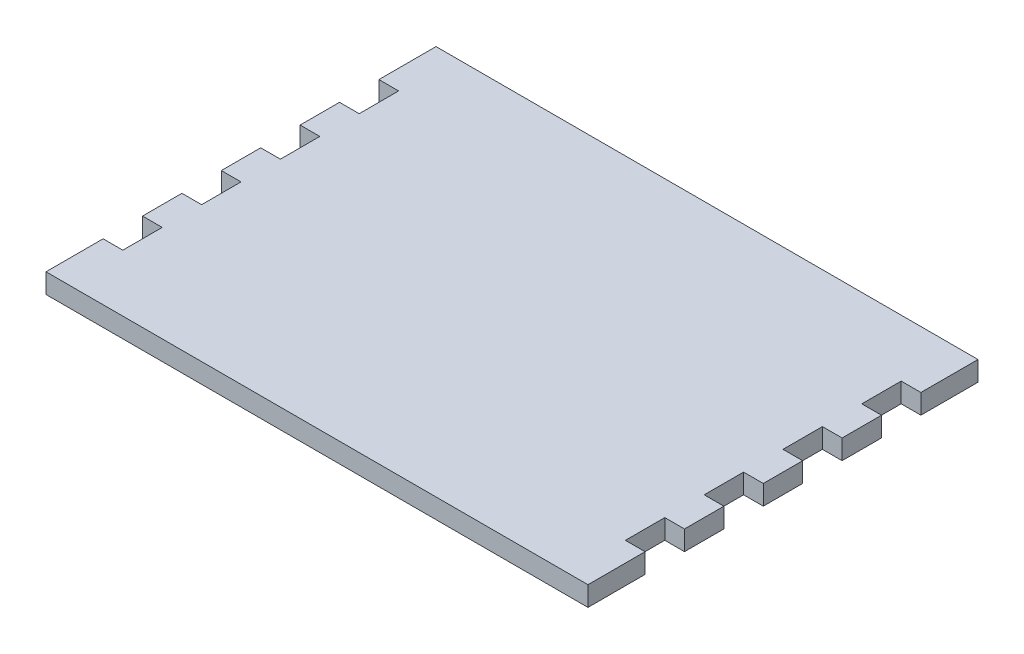
ISO-10303-21;
HEADER;
FILE_DESCRIPTION(('STEP AP214'),'2;1');
FILE_NAME('part.step','',(''),(''),'','','');
FILE_SCHEMA(('AUTOMOTIVE_DESIGN { 1 0 10303 214 1 1 1 1 }'));
ENDSEC;
DATA;
#1=APPLICATION_CONTEXT('core data for automotive mechanical design processes');
#2=APPLICATION_PROTOCOL_DEFINITION('international standard','automotive_design',2000,#1);
#3=PRODUCT_CONTEXT('',#1,'mechanical');
#4=PRODUCT('Part','Part','',(#3));
#5=PRODUCT_RELATED_PRODUCT_CATEGORY('part','',(#4));
#6=PRODUCT_DEFINITION_FORMATION('','',#4);
#7=PRODUCT_DEFINITION_CONTEXT('part definition',#1,'design');
#8=PRODUCT_DEFINITION('design','',#6,#7);
#9=PRODUCT_DEFINITION_SHAPE('','',#8);
#10=(LENGTH_UNIT() NAMED_UNIT(*) SI_UNIT(.MILLI.,.METRE.));
#11=(NAMED_UNIT(*) PLANE_ANGLE_UNIT() SI_UNIT($,.RADIAN.));
#12=(NAMED_UNIT(*) SI_UNIT($,.STERADIAN.) SOLID_ANGLE_UNIT());
#13=UNCERTAINTY_MEASURE_WITH_UNIT(LENGTH_MEASURE(1.E-05),#10,'distance_accuracy_value','');
#14=(GEOMETRIC_REPRESENTATION_CONTEXT(3) GLOBAL_UNCERTAINTY_ASSIGNED_CONTEXT((#13)) GLOBAL_UNIT_ASSIGNED_CONTEXT((#10,
#11,#12)) REPRESENTATION_CONTEXT('',''));
#15=CARTESIAN_POINT('',(0.,0.,0.));
#16=DIRECTION('',(0.,0.,1.));
#17=DIRECTION('',(1.,0.,0.));
#18=AXIS2_PLACEMENT_3D('',#15,#16,#17);
#19=CARTESIAN_POINT('',(87.35,3.175,0.));
#20=DIRECTION('',(0.,0.,-1.));
#21=DIRECTION('',(-1.,0.,0.));
#22=AXIS2_PLACEMENT_3D('',#19,#20,#21);
#23=PLANE('',#22);
#24=DIRECTION('',(1.,0.,0.));
#25=VECTOR('',#24,1.);
#26=CARTESIAN_POINT('',(87.35,0.,0.));
#27=LINE('',#26,#25);
#28=CARTESIAN_POINT('',(0.,0.,0.));
#29=VERTEX_POINT('',#28);
#30=CARTESIAN_POINT('',(87.35,0.,0.));
#31=VERTEX_POINT('',#30);
#32=EDGE_CURVE('E169',#29,#31,#27,.T.);
#33=ORIENTED_EDGE('',*,*,#32,.T.);
#34=DIRECTION('',(0.,-1.,0.));
#35=VECTOR('',#34,1.);
#36=CARTESIAN_POINT('',(87.35,3.175,0.));
#37=LINE('',#36,#35);
#38=CARTESIAN_POINT('',(87.35,3.175,0.));
#39=VERTEX_POINT('',#38);
#40=EDGE_CURVE('E11',#39,#31,#37,.T.);
#41=ORIENTED_EDGE('',*,*,#40,.F.);
#42=DIRECTION('',(1.,0.,0.));
#43=VECTOR('',#42,1.);
#44=CARTESIAN_POINT('',(0.,3.175,0.));
#45=LINE('',#44,#43);
#46=CARTESIAN_POINT('',(0.,3.175,0.));
#47=VERTEX_POINT('',#46);
#48=EDGE_CURVE('E175',#47,#39,#45,.T.);
#49=ORIENTED_EDGE('',*,*,#48,.F.);
#50=DIRECTION('',(0.,-1.,0.));
#51=VECTOR('',#50,1.);
#52=CARTESIAN_POINT('',(0.,3.175,0.));
#53=LINE('',#52,#51);
#54=EDGE_CURVE('E293',#47,#29,#53,.T.);
#55=ORIENTED_EDGE('',*,*,#54,.T.);
#56=EDGE_LOOP('',(#33,#41,#49,#55));
#57=FACE_BOUND('',#56,.T.);
#58=ADVANCED_FACE('F33',(#57),#23,.F.);
#59=CARTESIAN_POINT('',(87.35,3.175,0.));
#60=DIRECTION('',(-1.,0.,0.));
#61=DIRECTION('',(0.,0.,1.));
#62=AXIS2_PLACEMENT_3D('',#59,#60,#61);
#63=PLANE('',#62);
#64=DIRECTION('',(0.,0.,-1.));
#65=VECTOR('',#64,1.);
#66=CARTESIAN_POINT('',(87.35,0.,0.));
#67=LINE('',#66,#65);
#68=CARTESIAN_POINT('',(87.35,0.,-9.205896498));
#69=VERTEX_POINT('',#68);
#70=EDGE_CURVE('E298',#31,#69,#67,.T.);
#71=ORIENTED_EDGE('',*,*,#70,.T.);
#72=DIRECTION('',(0.,-1.,0.));
#73=VECTOR('',#72,1.);
#74=CARTESIAN_POINT('',(87.35,3.175,-9.205896498));
#75=LINE('',#74,#73);
#76=CARTESIAN_POINT('',(87.35,3.175,-9.205896498));
#77=VERTEX_POINT('',#76);
#78=EDGE_CURVE('E41',#77,#69,#75,.T.);
#79=ORIENTED_EDGE('',*,*,#78,.F.);
#80=DIRECTION('',(0.,0.,-1.));
#81=VECTOR('',#80,1.);
#82=CARTESIAN_POINT('',(87.35,3.175,0.));
#83=LINE('',#82,#81);
#84=EDGE_CURVE('E555',#39,#77,#83,.T.);
#85=ORIENTED_EDGE('',*,*,#84,.F.);
#86=ORIENTED_EDGE('',*,*,#40,.T.);
#87=EDGE_LOOP('',(#71,#79,#85,#86));
#88=FACE_BOUND('',#87,.T.);
#89=ADVANCED_FACE('F558',(#88),#63,.F.);
#90=CARTESIAN_POINT('',(87.35,3.175,-9.205896498));
#91=DIRECTION('',(0.,0.,1.));
#92=DIRECTION('',(1.,0.,0.));
#93=AXIS2_PLACEMENT_3D('',#90,#91,#92);
#94=PLANE('',#93);
#95=DIRECTION('',(-1.,0.,0.));
#96=VECTOR('',#95,1.);
#97=CARTESIAN_POINT('',(87.35,0.,-9.205896498));
#98=LINE('',#97,#96);
#99=CARTESIAN_POINT('',(84.175,0.,-9.205896498));
#100=VERTEX_POINT('',#99);
#101=EDGE_CURVE('E300',#69,#100,#98,.T.);
#102=ORIENTED_EDGE('',*,*,#101,.T.);
#103=DIRECTION('',(0.,-1.,0.));
#104=VECTOR('',#103,1.);
#105=CARTESIAN_POINT('',(84.175,3.175,-9.205896498));
#106=LINE('',#105,#104);
#107=CARTESIAN_POINT('',(84.175,3.175,-9.205896498));
#108=VERTEX_POINT('',#107);
#109=EDGE_CURVE('E458',#108,#100,#106,.T.);
#110=ORIENTED_EDGE('',*,*,#109,.F.);
#111=DIRECTION('',(-1.,0.,0.));
#112=VECTOR('',#111,1.);
#113=CARTESIAN_POINT('',(87.35,3.175,-9.205896498));
#114=LINE('',#113,#112);
#115=EDGE_CURVE('E467',#77,#108,#114,.T.);
#116=ORIENTED_EDGE('',*,*,#115,.F.);
#117=ORIENTED_EDGE('',*,*,#78,.T.);
#118=EDGE_LOOP('',(#102,#110,#116,#117));
#119=FACE_BOUND('',#118,.T.);
#120=ADVANCED_FACE('F465',(#119),#94,.F.);
#121=CARTESIAN_POINT('',(84.175,3.175,-9.205896498));
#122=DIRECTION('',(-1.,0.,0.));
#123=DIRECTION('',(0.,0.,1.));
#124=AXIS2_PLACEMENT_3D('',#121,#122,#123);
#125=PLANE('',#124);
#126=DIRECTION('',(0.,0.,-1.));
#127=VECTOR('',#126,1.);
#128=CARTESIAN_POINT('',(84.175,0.,-9.205896498));
#129=LINE('',#128,#127);
#130=CARTESIAN_POINT('',(84.175,0.,-15.555896498));
#131=VERTEX_POINT('',#130);
#132=EDGE_CURVE('E302',#100,#131,#129,.T.);
#133=ORIENTED_EDGE('',*,*,#132,.T.);
#134=DIRECTION('',(0.,-1.,0.));
#135=VECTOR('',#134,1.);
#136=CARTESIAN_POINT('',(84.175,3.175,-15.555896498));
#137=LINE('',#136,#135);
#138=CARTESIAN_POINT('',(84.175,3.175,-15.555896498));
#139=VERTEX_POINT('',#138);
#140=EDGE_CURVE('E455',#139,#131,#137,.T.);
#141=ORIENTED_EDGE('',*,*,#140,.F.);
#142=DIRECTION('',(0.,0.,-1.));
#143=VECTOR('',#142,1.);
#144=CARTESIAN_POINT('',(84.175,3.175,-9.205896498));
#145=LINE('',#144,#143);
#146=EDGE_CURVE('E485',#108,#139,#145,.T.);
#147=ORIENTED_EDGE('',*,*,#146,.F.);
#148=ORIENTED_EDGE('',*,*,#109,.T.);
#149=EDGE_LOOP('',(#133,#141,#147,#148));
#150=FACE_BOUND('',#149,.T.);
#151=ADVANCED_FACE('F476',(#150),#125,.F.);
#152=CARTESIAN_POINT('',(84.175,3.175,-15.555896498));
#153=DIRECTION('',(0.,0.,-1.));
#154=DIRECTION('',(-1.,0.,0.));
#155=AXIS2_PLACEMENT_3D('',#152,#153,#154);
#156=PLANE('',#155);
#157=DIRECTION('',(1.,0.,0.));
#158=VECTOR('',#157,1.);
#159=CARTESIAN_POINT('',(84.175,0.,-15.555896498));
#160=LINE('',#159,#158);
#161=CARTESIAN_POINT('',(87.35,0.,-15.555896498));
#162=VERTEX_POINT('',#161);
#163=EDGE_CURVE('E304',#131,#162,#160,.T.);
#164=ORIENTED_EDGE('',*,*,#163,.T.);
#165=DIRECTION('',(0.,-1.,0.));
#166=VECTOR('',#165,1.);
#167=CARTESIAN_POINT('',(87.35,3.175,-15.555896498));
#168=LINE('',#167,#166);
#169=CARTESIAN_POINT('',(87.35,3.175,-15.555896498));
#170=VERTEX_POINT('',#169);
#171=EDGE_CURVE('E452',#170,#162,#168,.T.);
#172=ORIENTED_EDGE('',*,*,#171,.F.);
#173=DIRECTION('',(1.,0.,0.));
#174=VECTOR('',#173,1.);
#175=CARTESIAN_POINT('',(84.175,3.175,-15.555896498));
#176=LINE('',#175,#174);
#177=EDGE_CURVE('E482',#139,#170,#176,.T.);
#178=ORIENTED_EDGE('',*,*,#177,.F.);
#179=ORIENTED_EDGE('',*,*,#140,.T.);
#180=EDGE_LOOP('',(#164,#172,#178,#179));
#181=FACE_BOUND('',#180,.T.);
#182=ADVANCED_FACE('F480',(#181),#156,.F.);
#183=CARTESIAN_POINT('',(87.35,3.175,-15.555896498));
#184=DIRECTION('',(-1.,0.,0.));
#185=DIRECTION('',(0.,0.,1.));
#186=AXIS2_PLACEMENT_3D('',#183,#184,#185);
#187=PLANE('',#186);
#188=DIRECTION('',(0.,0.,-1.));
#189=VECTOR('',#188,1.);
#190=CARTESIAN_POINT('',(87.35,0.,-15.555896498));
#191=LINE('',#190,#189);
#192=CARTESIAN_POINT('',(87.35,0.,-21.905896498));
#193=VERTEX_POINT('',#192);
#194=EDGE_CURVE('E306',#162,#193,#191,.T.);
#195=ORIENTED_EDGE('',*,*,#194,.T.);
#196=DIRECTION('',(0.,-1.,0.));
#197=VECTOR('',#196,1.);
#198=CARTESIAN_POINT('',(87.35,3.175,-21.905896498));
#199=LINE('',#198,#197);
#200=CARTESIAN_POINT('',(87.35,3.175,-21.905896498));
#201=VERTEX_POINT('',#200);
#202=EDGE_CURVE('E449',#201,#193,#199,.T.);
#203=ORIENTED_EDGE('',*,*,#202,.F.);
#204=DIRECTION('',(0.,0.,-1.));
#205=VECTOR('',#204,1.);
#206=CARTESIAN_POINT('',(87.35,3.175,-15.555896498));
#207=LINE('',#206,#205);
#208=EDGE_CURVE('E484',#170,#201,#207,.T.);
#209=ORIENTED_EDGE('',*,*,#208,.F.);
#210=ORIENTED_EDGE('',*,*,#171,.T.);
#211=EDGE_LOOP('',(#195,#203,#209,#210));
#212=FACE_BOUND('',#211,.T.);
#213=ADVANCED_FACE('F570',(#212),#187,.F.);
#214=CARTESIAN_POINT('',(87.35,3.175,-21.905896498));
#215=DIRECTION('',(0.,0.,1.));
#216=DIRECTION('',(1.,0.,0.));
#217=AXIS2_PLACEMENT_3D('',#214,#215,#216);
#218=PLANE('',#217);
#219=DIRECTION('',(-1.,0.,0.));
#220=VECTOR('',#219,1.);
#221=CARTESIAN_POINT('',(87.35,0.,-21.905896498));
#222=LINE('',#221,#220);
#223=CARTESIAN_POINT('',(84.175,0.,-21.905896498));
#224=VERTEX_POINT('',#223);
#225=EDGE_CURVE('E308',#193,#224,#222,.T.);
#226=ORIENTED_EDGE('',*,*,#225,.T.);
#227=DIRECTION('',(0.,-1.,0.));
#228=VECTOR('',#227,1.);
#229=CARTESIAN_POINT('',(84.175,3.175,-21.905896498));
#230=LINE('',#229,#228);
#231=CARTESIAN_POINT('',(84.175,3.175,-21.905896498));
#232=VERTEX_POINT('',#231);
#233=EDGE_CURVE('E446',#232,#224,#230,.T.);
#234=ORIENTED_EDGE('',*,*,#233,.F.);
#235=DIRECTION('',(-1.,0.,0.));
#236=VECTOR('',#235,1.);
#237=CARTESIAN_POINT('',(87.35,3.175,-21.905896498));
#238=LINE('',#237,#236);
#239=EDGE_CURVE('E487',#201,#232,#238,.T.);
#240=ORIENTED_EDGE('',*,*,#239,.F.);
#241=ORIENTED_EDGE('',*,*,#202,.T.);
#242=EDGE_LOOP('',(#226,#234,#240,#241));
#243=FACE_BOUND('',#242,.T.);
#244=ADVANCED_FACE('F573',(#243),#218,.F.);
#245=CARTESIAN_POINT('',(84.175,3.175,-21.905896498));
#246=DIRECTION('',(-1.,0.,0.));
#247=DIRECTION('',(0.,0.,1.));
#248=AXIS2_PLACEMENT_3D('',#245,#246,#247);
#249=PLANE('',#248);
#250=DIRECTION('',(0.,0.,-1.));
#251=VECTOR('',#250,1.);
#252=CARTESIAN_POINT('',(84.175,0.,-21.905896498));
#253=LINE('',#252,#251);
#254=CARTESIAN_POINT('',(84.175,0.,-28.255896498));
#255=VERTEX_POINT('',#254);
#256=EDGE_CURVE('E310',#224,#255,#253,.T.);
#257=ORIENTED_EDGE('',*,*,#256,.T.);
#258=DIRECTION('',(0.,-1.,0.));
#259=VECTOR('',#258,1.);
#260=CARTESIAN_POINT('',(84.175,3.175,-28.255896498));
#261=LINE('',#260,#259);
#262=CARTESIAN_POINT('',(84.175,3.175,-28.255896498));
#263=VERTEX_POINT('',#262);
#264=EDGE_CURVE('E443',#263,#255,#261,.T.);
#265=ORIENTED_EDGE('',*,*,#264,.F.);
#266=DIRECTION('',(0.,0.,-1.));
#267=VECTOR('',#266,1.);
#268=CARTESIAN_POINT('',(84.175,3.175,-21.905896498));
#269=LINE('',#268,#267);
#270=EDGE_CURVE('E493',#232,#263,#269,.T.);
#271=ORIENTED_EDGE('',*,*,#270,.F.);
#272=ORIENTED_EDGE('',*,*,#233,.T.);
#273=EDGE_LOOP('',(#257,#265,#271,#272));
#274=FACE_BOUND('',#273,.T.);
#275=ADVANCED_FACE('F577',(#274),#249,.F.);
#276=CARTESIAN_POINT('',(84.175,3.175,-28.255896498));
#277=DIRECTION('',(0.,0.,-1.));
#278=DIRECTION('',(-1.,0.,0.));
#279=AXIS2_PLACEMENT_3D('',#276,#277,#278);
#280=PLANE('',#279);
#281=DIRECTION('',(1.,0.,0.));
#282=VECTOR('',#281,1.);
#283=CARTESIAN_POINT('',(84.175,0.,-28.255896498));
#284=LINE('',#283,#282);
#285=CARTESIAN_POINT('',(87.35,0.,-28.255896498));
#286=VERTEX_POINT('',#285);
#287=EDGE_CURVE('E312',#255,#286,#284,.T.);
#288=ORIENTED_EDGE('',*,*,#287,.T.);
#289=DIRECTION('',(0.,-1.,0.));
#290=VECTOR('',#289,1.);
#291=CARTESIAN_POINT('',(87.35,3.175,-28.255896498));
#292=LINE('',#291,#290);
#293=CARTESIAN_POINT('',(87.35,3.175,-28.255896498));
#294=VERTEX_POINT('',#293);
#295=EDGE_CURVE('E440',#294,#286,#292,.T.);
#296=ORIENTED_EDGE('',*,*,#295,.F.);
#297=DIRECTION('',(1.,0.,0.));
#298=VECTOR('',#297,1.);
#299=CARTESIAN_POINT('',(84.175,3.175,-28.255896498));
#300=LINE('',#299,#298);
#301=EDGE_CURVE('E495',#263,#294,#300,.T.);
#302=ORIENTED_EDGE('',*,*,#301,.F.);
#303=ORIENTED_EDGE('',*,*,#264,.T.);
#304=EDGE_LOOP('',(#288,#296,#302,#303));
#305=FACE_BOUND('',#304,.T.);
#306=ADVANCED_FACE('F581',(#305),#280,.F.);
#307=CARTESIAN_POINT('',(87.35,3.175,-28.255896498));
#308=DIRECTION('',(-1.,0.,0.));
#309=DIRECTION('',(0.,0.,1.));
#310=AXIS2_PLACEMENT_3D('',#307,#308,#309);
#311=PLANE('',#310);
#312=DIRECTION('',(0.,0.,-1.));
#313=VECTOR('',#312,1.);
#314=CARTESIAN_POINT('',(87.35,0.,-28.255896498));
#315=LINE('',#314,#313);
#316=CARTESIAN_POINT('',(87.35,0.,-34.605896498));
#317=VERTEX_POINT('',#316);
#318=EDGE_CURVE('E314',#286,#317,#315,.T.);
#319=ORIENTED_EDGE('',*,*,#318,.T.);
#320=DIRECTION('',(0.,-1.,0.));
#321=VECTOR('',#320,1.);
#322=CARTESIAN_POINT('',(87.35,3.175,-34.605896498));
#323=LINE('',#322,#321);
#324=CARTESIAN_POINT('',(87.35,3.175,-34.605896498));
#325=VERTEX_POINT('',#324);
#326=EDGE_CURVE('E437',#325,#317,#323,.T.);
#327=ORIENTED_EDGE('',*,*,#326,.F.);
#328=DIRECTION('',(0.,0.,-1.));
#329=VECTOR('',#328,1.);
#330=CARTESIAN_POINT('',(87.35,3.175,-28.255896498));
#331=LINE('',#330,#329);
#332=EDGE_CURVE('E497',#294,#325,#331,.T.);
#333=ORIENTED_EDGE('',*,*,#332,.F.);
#334=ORIENTED_EDGE('',*,*,#295,.T.);
#335=EDGE_LOOP('',(#319,#327,#333,#334));
#336=FACE_BOUND('',#335,.T.);
#337=ADVANCED_FACE('F585',(#336),#311,.F.);
#338=CARTESIAN_POINT('',(87.35,3.175,-34.605896498));
#339=DIRECTION('',(0.,0.,1.));
#340=DIRECTION('',(1.,0.,0.));
#341=AXIS2_PLACEMENT_3D('',#338,#339,#340);
#342=PLANE('',#341);
#343=DIRECTION('',(-1.,0.,0.));
#344=VECTOR('',#343,1.);
#345=CARTESIAN_POINT('',(87.35,0.,-34.605896498));
#346=LINE('',#345,#344);
#347=CARTESIAN_POINT('',(84.175,0.,-34.605896498));
#348=VERTEX_POINT('',#347);
#349=EDGE_CURVE('E316',#317,#348,#346,.T.);
#350=ORIENTED_EDGE('',*,*,#349,.T.);
#351=DIRECTION('',(0.,-1.,0.));
#352=VECTOR('',#351,1.);
#353=CARTESIAN_POINT('',(84.175,3.175,-34.605896498));
#354=LINE('',#353,#352);
#355=CARTESIAN_POINT('',(84.175,3.175,-34.605896498));
#356=VERTEX_POINT('',#355);
#357=EDGE_CURVE('E434',#356,#348,#354,.T.);
#358=ORIENTED_EDGE('',*,*,#357,.F.);
#359=DIRECTION('',(-1.,0.,0.));
#360=VECTOR('',#359,1.);
#361=CARTESIAN_POINT('',(87.35,3.175,-34.605896498));
#362=LINE('',#361,#360);
#363=EDGE_CURVE('E499',#325,#356,#362,.T.);
#364=ORIENTED_EDGE('',*,*,#363,.F.);
#365=ORIENTED_EDGE('',*,*,#326,.T.);
#366=EDGE_LOOP('',(#350,#358,#364,#365));
#367=FACE_BOUND('',#366,.T.);
#368=ADVANCED_FACE('F589',(#367),#342,.F.);
#369=CARTESIAN_POINT('',(84.175,3.175,-34.605896498));
#370=DIRECTION('',(-1.,0.,0.));
#371=DIRECTION('',(0.,0.,1.));
#372=AXIS2_PLACEMENT_3D('',#369,#370,#371);
#373=PLANE('',#372);
#374=DIRECTION('',(0.,0.,-1.));
#375=VECTOR('',#374,1.);
#376=CARTESIAN_POINT('',(84.175,0.,-34.605896498));
#377=LINE('',#376,#375);
#378=CARTESIAN_POINT('',(84.175,0.,-40.955896498));
#379=VERTEX_POINT('',#378);
#380=EDGE_CURVE('E318',#348,#379,#377,.T.);
#381=ORIENTED_EDGE('',*,*,#380,.T.);
#382=DIRECTION('',(0.,-1.,0.));
#383=VECTOR('',#382,1.);
#384=CARTESIAN_POINT('',(84.175,3.175,-40.955896498));
#385=LINE('',#384,#383);
#386=CARTESIAN_POINT('',(84.175,3.175,-40.955896498));
#387=VERTEX_POINT('',#386);
#388=EDGE_CURVE('E431',#387,#379,#385,.T.);
#389=ORIENTED_EDGE('',*,*,#388,.F.);
#390=DIRECTION('',(0.,0.,-1.));
#391=VECTOR('',#390,1.);
#392=CARTESIAN_POINT('',(84.175,3.175,-34.605896498));
#393=LINE('',#392,#391);
#394=EDGE_CURVE('E501',#356,#387,#393,.T.);
#395=ORIENTED_EDGE('',*,*,#394,.F.);
#396=ORIENTED_EDGE('',*,*,#357,.T.);
#397=EDGE_LOOP('',(#381,#389,#395,#396));
#398=FACE_BOUND('',#397,.T.);
#399=ADVANCED_FACE('F593',(#398),#373,.F.);
#400=CARTESIAN_POINT('',(84.175,3.175,-40.955896498));
#401=DIRECTION('',(0.,0.,-1.));
#402=DIRECTION('',(-1.,0.,0.));
#403=AXIS2_PLACEMENT_3D('',#400,#401,#402);
#404=PLANE('',#403);
#405=DIRECTION('',(1.,0.,0.));
#406=VECTOR('',#405,1.);
#407=CARTESIAN_POINT('',(84.175,0.,-40.955896498));
#408=LINE('',#407,#406);
#409=CARTESIAN_POINT('',(87.35,0.,-40.955896498));
#410=VERTEX_POINT('',#409);
#411=EDGE_CURVE('E320',#379,#410,#408,.T.);
#412=ORIENTED_EDGE('',*,*,#411,.T.);
#413=DIRECTION('',(0.,-1.,0.));
#414=VECTOR('',#413,1.);
#415=CARTESIAN_POINT('',(87.35,3.175,-40.955896498));
#416=LINE('',#415,#414);
#417=CARTESIAN_POINT('',(87.35,3.175,-40.955896498));
#418=VERTEX_POINT('',#417);
#419=EDGE_CURVE('E428',#418,#410,#416,.T.);
#420=ORIENTED_EDGE('',*,*,#419,.F.);
#421=DIRECTION('',(1.,0.,0.));
#422=VECTOR('',#421,1.);
#423=CARTESIAN_POINT('',(84.175,3.175,-40.955896498));
#424=LINE('',#423,#422);
#425=EDGE_CURVE('E503',#387,#418,#424,.T.);
#426=ORIENTED_EDGE('',*,*,#425,.F.);
#427=ORIENTED_EDGE('',*,*,#388,.T.);
#428=EDGE_LOOP('',(#412,#420,#426,#427));
#429=FACE_BOUND('',#428,.T.);
#430=ADVANCED_FACE('F597',(#429),#404,.F.);
#431=CARTESIAN_POINT('',(87.35,3.175,-40.955896498));
#432=DIRECTION('',(-1.,0.,0.));
#433=DIRECTION('',(0.,0.,1.));
#434=AXIS2_PLACEMENT_3D('',#431,#432,#433);
#435=PLANE('',#434);
#436=DIRECTION('',(0.,0.,-1.));
#437=VECTOR('',#436,1.);
#438=CARTESIAN_POINT('',(87.35,0.,-40.955896498));
#439=LINE('',#438,#437);
#440=CARTESIAN_POINT('',(87.35,0.,-47.305896498));
#441=VERTEX_POINT('',#440);
#442=EDGE_CURVE('E322',#410,#441,#439,.T.);
#443=ORIENTED_EDGE('',*,*,#442,.T.);
#444=DIRECTION('',(0.,-1.,0.));
#445=VECTOR('',#444,1.);
#446=CARTESIAN_POINT('',(87.35,3.175,-47.305896498));
#447=LINE('',#446,#445);
#448=CARTESIAN_POINT('',(87.35,3.175,-47.305896498));
#449=VERTEX_POINT('',#448);
#450=EDGE_CURVE('E425',#449,#441,#447,.T.);
#451=ORIENTED_EDGE('',*,*,#450,.F.);
#452=DIRECTION('',(0.,0.,-1.));
#453=VECTOR('',#452,1.);
#454=CARTESIAN_POINT('',(87.35,3.175,-40.955896498));
#455=LINE('',#454,#453);
#456=EDGE_CURVE('E505',#418,#449,#455,.T.);
#457=ORIENTED_EDGE('',*,*,#456,.F.);
#458=ORIENTED_EDGE('',*,*,#419,.T.);
#459=EDGE_LOOP('',(#443,#451,#457,#458));
#460=FACE_BOUND('',#459,.T.);
#461=ADVANCED_FACE('F601',(#460),#435,.F.);
#462=CARTESIAN_POINT('',(87.35,3.175,-47.305896498));
#463=DIRECTION('',(0.,0.,1.));
#464=DIRECTION('',(1.,0.,0.));
#465=AXIS2_PLACEMENT_3D('',#462,#463,#464);
#466=PLANE('',#465);
#467=DIRECTION('',(-1.,0.,0.));
#468=VECTOR('',#467,1.);
#469=CARTESIAN_POINT('',(87.35,0.,-47.305896498));
#470=LINE('',#469,#468);
#471=CARTESIAN_POINT('',(84.175,0.,-47.305896498));
#472=VERTEX_POINT('',#471);
#473=EDGE_CURVE('E324',#441,#472,#470,.T.);
#474=ORIENTED_EDGE('',*,*,#473,.T.);
#475=DIRECTION('',(0.,-1.,0.));
#476=VECTOR('',#475,1.);
#477=CARTESIAN_POINT('',(84.175,3.175,-47.305896498));
#478=LINE('',#477,#476);
#479=CARTESIAN_POINT('',(84.175,3.175,-47.305896498));
#480=VERTEX_POINT('',#479);
#481=EDGE_CURVE('E422',#480,#472,#478,.T.);
#482=ORIENTED_EDGE('',*,*,#481,.F.);
#483=DIRECTION('',(-1.,0.,0.));
#484=VECTOR('',#483,1.);
#485=CARTESIAN_POINT('',(87.35,3.175,-47.305896498));
#486=LINE('',#485,#484);
#487=EDGE_CURVE('E507',#449,#480,#486,.T.);
#488=ORIENTED_EDGE('',*,*,#487,.F.);
#489=ORIENTED_EDGE('',*,*,#450,.T.);
#490=EDGE_LOOP('',(#474,#482,#488,#489));
#491=FACE_BOUND('',#490,.T.);
#492=ADVANCED_FACE('F605',(#491),#466,.F.);
#493=CARTESIAN_POINT('',(84.175,3.175,-47.305896498));
#494=DIRECTION('',(-1.,0.,0.));
#495=DIRECTION('',(0.,0.,1.));
#496=AXIS2_PLACEMENT_3D('',#493,#494,#495);
#497=PLANE('',#496);
#498=DIRECTION('',(0.,0.,-1.));
#499=VECTOR('',#498,1.);
#500=CARTESIAN_POINT('',(84.175,0.,-47.305896498));
#501=LINE('',#500,#499);
#502=CARTESIAN_POINT('',(84.175,0.,-53.655896498));
#503=VERTEX_POINT('',#502);
#504=EDGE_CURVE('E326',#472,#503,#501,.T.);
#505=ORIENTED_EDGE('',*,*,#504,.T.);
#506=DIRECTION('',(0.,-1.,0.));
#507=VECTOR('',#506,1.);
#508=CARTESIAN_POINT('',(84.175,3.175,-53.655896498));
#509=LINE('',#508,#507);
#510=CARTESIAN_POINT('',(84.175,3.175,-53.655896498));
#511=VERTEX_POINT('',#510);
#512=EDGE_CURVE('E419',#511,#503,#509,.T.);
#513=ORIENTED_EDGE('',*,*,#512,.F.);
#514=DIRECTION('',(0.,0.,-1.));
#515=VECTOR('',#514,1.);
#516=CARTESIAN_POINT('',(84.175,3.175,-47.305896498));
#517=LINE('',#516,#515);
#518=EDGE_CURVE('E509',#480,#511,#517,.T.);
#519=ORIENTED_EDGE('',*,*,#518,.F.);
#520=ORIENTED_EDGE('',*,*,#481,.T.);
#521=EDGE_LOOP('',(#505,#513,#519,#520));
#522=FACE_BOUND('',#521,.T.);
#523=ADVANCED_FACE('F609',(#522),#497,.F.);
#524=CARTESIAN_POINT('',(84.175,3.175,-53.655896498));
#525=DIRECTION('',(0.,0.,-1.));
#526=DIRECTION('',(-1.,0.,0.));
#527=AXIS2_PLACEMENT_3D('',#524,#525,#526);
#528=PLANE('',#527);
#529=DIRECTION('',(1.,0.,0.));
#530=VECTOR('',#529,1.);
#531=CARTESIAN_POINT('',(84.175,0.,-53.655896498));
#532=LINE('',#531,#530);
#533=CARTESIAN_POINT('',(87.35,0.,-53.655896498));
#534=VERTEX_POINT('',#533);
#535=EDGE_CURVE('E328',#503,#534,#532,.T.);
#536=ORIENTED_EDGE('',*,*,#535,.T.);
#537=DIRECTION('',(0.,-1.,0.));
#538=VECTOR('',#537,1.);
#539=CARTESIAN_POINT('',(87.35,3.175,-53.655896498));
#540=LINE('',#539,#538);
#541=CARTESIAN_POINT('',(87.35,3.175,-53.655896498));
#542=VERTEX_POINT('',#541);
#543=EDGE_CURVE('E416',#542,#534,#540,.T.);
#544=ORIENTED_EDGE('',*,*,#543,.F.);
#545=DIRECTION('',(1.,0.,0.));
#546=VECTOR('',#545,1.);
#547=CARTESIAN_POINT('',(84.175,3.175,-53.655896498));
#548=LINE('',#547,#546);
#549=EDGE_CURVE('E511',#511,#542,#548,.T.);
#550=ORIENTED_EDGE('',*,*,#549,.F.);
#551=ORIENTED_EDGE('',*,*,#512,.T.);
#552=EDGE_LOOP('',(#536,#544,#550,#551));
#553=FACE_BOUND('',#552,.T.);
#554=ADVANCED_FACE('F613',(#553),#528,.F.);
#555=CARTESIAN_POINT('',(87.35,3.175,-53.655896498));
#556=DIRECTION('',(-1.,0.,0.));
#557=DIRECTION('',(0.,0.,1.));
#558=AXIS2_PLACEMENT_3D('',#555,#556,#557);
#559=PLANE('',#558);
#560=DIRECTION('',(0.,0.,-1.));
#561=VECTOR('',#560,1.);
#562=CARTESIAN_POINT('',(87.35,0.,-53.655896498));
#563=LINE('',#562,#561);
#564=CARTESIAN_POINT('',(87.35,0.,-62.861792996));
#565=VERTEX_POINT('',#564);
#566=EDGE_CURVE('E330',#534,#565,#563,.T.);
#567=ORIENTED_EDGE('',*,*,#566,.T.);
#568=DIRECTION('',(0.,-1.,0.));
#569=VECTOR('',#568,1.);
#570=CARTESIAN_POINT('',(87.35,3.175,-62.861792996));
#571=LINE('',#570,#569);
#572=CARTESIAN_POINT('',(87.35,3.175,-62.861792996));
#573=VERTEX_POINT('',#572);
#574=EDGE_CURVE('E413',#573,#565,#571,.T.);
#575=ORIENTED_EDGE('',*,*,#574,.F.);
#576=DIRECTION('',(0.,0.,-1.));
#577=VECTOR('',#576,1.);
#578=CARTESIAN_POINT('',(87.35,3.175,-53.655896498));
#579=LINE('',#578,#577);
#580=EDGE_CURVE('E513',#542,#573,#579,.T.);
#581=ORIENTED_EDGE('',*,*,#580,.F.);
#582=ORIENTED_EDGE('',*,*,#543,.T.);
#583=EDGE_LOOP('',(#567,#575,#581,#582));
#584=FACE_BOUND('',#583,.T.);
#585=ADVANCED_FACE('F617',(#584),#559,.F.);
#586=CARTESIAN_POINT('',(0.,3.175,-62.861792996));
#587=DIRECTION('',(0.,0.,1.));
#588=DIRECTION('',(1.,0.,0.));
#589=AXIS2_PLACEMENT_3D('',#586,#587,#588);
#590=PLANE('',#589);
#591=DIRECTION('',(-1.,0.,0.));
#592=VECTOR('',#591,1.);
#593=CARTESIAN_POINT('',(0.,0.,-62.861792996));
#594=LINE('',#593,#592);
#595=CARTESIAN_POINT('',(0.,0.,-62.861792996));
#596=VERTEX_POINT('',#595);
#597=EDGE_CURVE('E333',#565,#596,#594,.T.);
#598=ORIENTED_EDGE('',*,*,#597,.T.);
#599=DIRECTION('',(0.,-1.,0.));
#600=VECTOR('',#599,1.);
#601=CARTESIAN_POINT('',(0.,3.175,-62.861792996));
#602=LINE('',#601,#600);
#603=CARTESIAN_POINT('',(0.,3.175,-62.861792996));
#604=VERTEX_POINT('',#603);
#605=EDGE_CURVE('E410',#604,#596,#602,.T.);
#606=ORIENTED_EDGE('',*,*,#605,.F.);
#607=DIRECTION('',(-1.,0.,0.));
#608=VECTOR('',#607,1.);
#609=CARTESIAN_POINT('',(87.35,3.175,-62.861792996));
#610=LINE('',#609,#608);
#611=EDGE_CURVE('E515',#573,#604,#610,.T.);
#612=ORIENTED_EDGE('',*,*,#611,.F.);
#613=ORIENTED_EDGE('',*,*,#574,.T.);
#614=EDGE_LOOP('',(#598,#606,#612,#613));
#615=FACE_BOUND('',#614,.T.);
#616=ADVANCED_FACE('F621',(#615),#590,.F.);
#617=CARTESIAN_POINT('',(0.,3.175,-53.655896498));
#618=DIRECTION('',(1.,0.,0.));
#619=DIRECTION('',(0.,0.,-1.));
#620=AXIS2_PLACEMENT_3D('',#617,#618,#619);
#621=PLANE('',#620);
#622=DIRECTION('',(0.,0.,1.));
#623=VECTOR('',#622,1.);
#624=CARTESIAN_POINT('',(0.,0.,-53.655896498));
#625=LINE('',#624,#623);
#626=CARTESIAN_POINT('',(0.,0.,-53.655896498));
#627=VERTEX_POINT('',#626);
#628=EDGE_CURVE('E335',#596,#627,#625,.T.);
#629=ORIENTED_EDGE('',*,*,#628,.T.);
#630=DIRECTION('',(0.,-1.,0.));
#631=VECTOR('',#630,1.);
#632=CARTESIAN_POINT('',(0.,3.175,-53.655896498));
#633=LINE('',#632,#631);
#634=CARTESIAN_POINT('',(0.,3.175,-53.655896498));
#635=VERTEX_POINT('',#634);
#636=EDGE_CURVE('E407',#635,#627,#633,.T.);
#637=ORIENTED_EDGE('',*,*,#636,.F.);
#638=DIRECTION('',(0.,0.,1.));
#639=VECTOR('',#638,1.);
#640=CARTESIAN_POINT('',(0.,3.175,-53.655896498));
#641=LINE('',#640,#639);
#642=EDGE_CURVE('E517',#604,#635,#641,.T.);
#643=ORIENTED_EDGE('',*,*,#642,.F.);
#644=ORIENTED_EDGE('',*,*,#605,.T.);
#645=EDGE_LOOP('',(#629,#637,#643,#644));
#646=FACE_BOUND('',#645,.T.);
#647=ADVANCED_FACE('F625',(#646),#621,.F.);
#648=CARTESIAN_POINT('',(3.175,3.175,-53.655896498));
#649=DIRECTION('',(0.,0.,-1.));
#650=DIRECTION('',(-1.,0.,0.));
#651=AXIS2_PLACEMENT_3D('',#648,#649,#650);
#652=PLANE('',#651);
#653=DIRECTION('',(1.,0.,0.));
#654=VECTOR('',#653,1.);
#655=CARTESIAN_POINT('',(3.175,0.,-53.655896498));
#656=LINE('',#655,#654);
#657=CARTESIAN_POINT('',(3.175,0.,-53.655896498));
#658=VERTEX_POINT('',#657);
#659=EDGE_CURVE('E337',#627,#658,#656,.T.);
#660=ORIENTED_EDGE('',*,*,#659,.T.);
#661=DIRECTION('',(0.,-1.,0.));
#662=VECTOR('',#661,1.);
#663=CARTESIAN_POINT('',(3.175,3.175,-53.655896498));
#664=LINE('',#663,#662);
#665=CARTESIAN_POINT('',(3.175,3.175,-53.655896498));
#666=VERTEX_POINT('',#665);
#667=EDGE_CURVE('E404',#666,#658,#664,.T.);
#668=ORIENTED_EDGE('',*,*,#667,.F.);
#669=DIRECTION('',(1.,0.,0.));
#670=VECTOR('',#669,1.);
#671=CARTESIAN_POINT('',(3.175,3.175,-53.655896498));
#672=LINE('',#671,#670);
#673=EDGE_CURVE('E519',#635,#666,#672,.T.);
#674=ORIENTED_EDGE('',*,*,#673,.F.);
#675=ORIENTED_EDGE('',*,*,#636,.T.);
#676=EDGE_LOOP('',(#660,#668,#674,#675));
#677=FACE_BOUND('',#676,.T.);
#678=ADVANCED_FACE('F629',(#677),#652,.F.);
#679=CARTESIAN_POINT('',(3.175,3.175,-47.305896498));
#680=DIRECTION('',(1.,0.,0.));
#681=DIRECTION('',(0.,0.,-1.));
#682=AXIS2_PLACEMENT_3D('',#679,#680,#681);
#683=PLANE('',#682);
#684=DIRECTION('',(0.,0.,1.));
#685=VECTOR('',#684,1.);
#686=CARTESIAN_POINT('',(3.175,0.,-47.305896498));
#687=LINE('',#686,#685);
#688=CARTESIAN_POINT('',(3.175,0.,-47.305896498));
#689=VERTEX_POINT('',#688);
#690=EDGE_CURVE('E339',#658,#689,#687,.T.);
#691=ORIENTED_EDGE('',*,*,#690,.T.);
#692=DIRECTION('',(0.,-1.,0.));
#693=VECTOR('',#692,1.);
#694=CARTESIAN_POINT('',(3.175,3.175,-47.305896498));
#695=LINE('',#694,#693);
#696=CARTESIAN_POINT('',(3.175,3.175,-47.305896498));
#697=VERTEX_POINT('',#696);
#698=EDGE_CURVE('E401',#697,#689,#695,.T.);
#699=ORIENTED_EDGE('',*,*,#698,.F.);
#700=DIRECTION('',(0.,0.,1.));
#701=VECTOR('',#700,1.);
#702=CARTESIAN_POINT('',(3.175,3.175,-47.305896498));
#703=LINE('',#702,#701);
#704=EDGE_CURVE('E521',#666,#697,#703,.T.);
#705=ORIENTED_EDGE('',*,*,#704,.F.);
#706=ORIENTED_EDGE('',*,*,#667,.T.);
#707=EDGE_LOOP('',(#691,#699,#705,#706));
#708=FACE_BOUND('',#707,.T.);
#709=ADVANCED_FACE('F633',(#708),#683,.F.);
#710=CARTESIAN_POINT('',(0.,3.175,-47.305896498));
#711=DIRECTION('',(0.,0.,1.));
#712=DIRECTION('',(1.,0.,0.));
#713=AXIS2_PLACEMENT_3D('',#710,#711,#712);
#714=PLANE('',#713);
#715=DIRECTION('',(-1.,0.,0.));
#716=VECTOR('',#715,1.);
#717=CARTESIAN_POINT('',(0.,0.,-47.305896498));
#718=LINE('',#717,#716);
#719=CARTESIAN_POINT('',(0.,0.,-47.305896498));
#720=VERTEX_POINT('',#719);
#721=EDGE_CURVE('E341',#689,#720,#718,.T.);
#722=ORIENTED_EDGE('',*,*,#721,.T.);
#723=DIRECTION('',(0.,-1.,0.));
#724=VECTOR('',#723,1.);
#725=CARTESIAN_POINT('',(0.,3.175,-47.305896498));
#726=LINE('',#725,#724);
#727=CARTESIAN_POINT('',(0.,3.175,-47.305896498));
#728=VERTEX_POINT('',#727);
#729=EDGE_CURVE('E398',#728,#720,#726,.T.);
#730=ORIENTED_EDGE('',*,*,#729,.F.);
#731=DIRECTION('',(-1.,0.,0.));
#732=VECTOR('',#731,1.);
#733=CARTESIAN_POINT('',(0.,3.175,-47.305896498));
#734=LINE('',#733,#732);
#735=EDGE_CURVE('E523',#697,#728,#734,.T.);
#736=ORIENTED_EDGE('',*,*,#735,.F.);
#737=ORIENTED_EDGE('',*,*,#698,.T.);
#738=EDGE_LOOP('',(#722,#730,#736,#737));
#739=FACE_BOUND('',#738,.T.);
#740=ADVANCED_FACE('F637',(#739),#714,.F.);
#741=CARTESIAN_POINT('',(0.,3.175,-40.955896498));
#742=DIRECTION('',(1.,0.,0.));
#743=DIRECTION('',(0.,0.,-1.));
#744=AXIS2_PLACEMENT_3D('',#741,#742,#743);
#745=PLANE('',#744);
#746=DIRECTION('',(0.,0.,1.));
#747=VECTOR('',#746,1.);
#748=CARTESIAN_POINT('',(0.,0.,-40.955896498));
#749=LINE('',#748,#747);
#750=CARTESIAN_POINT('',(0.,0.,-40.955896498));
#751=VERTEX_POINT('',#750);
#752=EDGE_CURVE('E343',#720,#751,#749,.T.);
#753=ORIENTED_EDGE('',*,*,#752,.T.);
#754=DIRECTION('',(0.,-1.,0.));
#755=VECTOR('',#754,1.);
#756=CARTESIAN_POINT('',(0.,3.175,-40.955896498));
#757=LINE('',#756,#755);
#758=CARTESIAN_POINT('',(0.,3.175,-40.955896498));
#759=VERTEX_POINT('',#758);
#760=EDGE_CURVE('E395',#759,#751,#757,.T.);
#761=ORIENTED_EDGE('',*,*,#760,.F.);
#762=DIRECTION('',(0.,0.,1.));
#763=VECTOR('',#762,1.);
#764=CARTESIAN_POINT('',(0.,3.175,-40.955896498));
#765=LINE('',#764,#763);
#766=EDGE_CURVE('E525',#728,#759,#765,.T.);
#767=ORIENTED_EDGE('',*,*,#766,.F.);
#768=ORIENTED_EDGE('',*,*,#729,.T.);
#769=EDGE_LOOP('',(#753,#761,#767,#768));
#770=FACE_BOUND('',#769,.T.);
#771=ADVANCED_FACE('F641',(#770),#745,.F.);
#772=CARTESIAN_POINT('',(3.175,3.175,-40.955896498));
#773=DIRECTION('',(0.,0.,-1.));
#774=DIRECTION('',(-1.,0.,0.));
#775=AXIS2_PLACEMENT_3D('',#772,#773,#774);
#776=PLANE('',#775);
#777=DIRECTION('',(1.,0.,0.));
#778=VECTOR('',#777,1.);
#779=CARTESIAN_POINT('',(3.175,0.,-40.955896498));
#780=LINE('',#779,#778);
#781=CARTESIAN_POINT('',(3.175,0.,-40.955896498));
#782=VERTEX_POINT('',#781);
#783=EDGE_CURVE('E345',#751,#782,#780,.T.);
#784=ORIENTED_EDGE('',*,*,#783,.T.);
#785=DIRECTION('',(0.,-1.,0.));
#786=VECTOR('',#785,1.);
#787=CARTESIAN_POINT('',(3.175,3.175,-40.955896498));
#788=LINE('',#787,#786);
#789=CARTESIAN_POINT('',(3.175,3.175,-40.955896498));
#790=VERTEX_POINT('',#789);
#791=EDGE_CURVE('E392',#790,#782,#788,.T.);
#792=ORIENTED_EDGE('',*,*,#791,.F.);
#793=DIRECTION('',(1.,0.,0.));
#794=VECTOR('',#793,1.);
#795=CARTESIAN_POINT('',(3.175,3.175,-40.955896498));
#796=LINE('',#795,#794);
#797=EDGE_CURVE('E527',#759,#790,#796,.T.);
#798=ORIENTED_EDGE('',*,*,#797,.F.);
#799=ORIENTED_EDGE('',*,*,#760,.T.);
#800=EDGE_LOOP('',(#784,#792,#798,#799));
#801=FACE_BOUND('',#800,.T.);
#802=ADVANCED_FACE('F645',(#801),#776,.F.);
#803=CARTESIAN_POINT('',(3.175,3.175,-34.605896498));
#804=DIRECTION('',(1.,0.,0.));
#805=DIRECTION('',(0.,0.,-1.));
#806=AXIS2_PLACEMENT_3D('',#803,#804,#805);
#807=PLANE('',#806);
#808=DIRECTION('',(0.,0.,1.));
#809=VECTOR('',#808,1.);
#810=CARTESIAN_POINT('',(3.175,0.,-34.605896498));
#811=LINE('',#810,#809);
#812=CARTESIAN_POINT('',(3.175,0.,-34.605896498));
#813=VERTEX_POINT('',#812);
#814=EDGE_CURVE('E347',#782,#813,#811,.T.);
#815=ORIENTED_EDGE('',*,*,#814,.T.);
#816=DIRECTION('',(0.,-1.,0.));
#817=VECTOR('',#816,1.);
#818=CARTESIAN_POINT('',(3.175,3.175,-34.605896498));
#819=LINE('',#818,#817);
#820=CARTESIAN_POINT('',(3.175,3.175,-34.605896498));
#821=VERTEX_POINT('',#820);
#822=EDGE_CURVE('E389',#821,#813,#819,.T.);
#823=ORIENTED_EDGE('',*,*,#822,.F.);
#824=DIRECTION('',(0.,0.,1.));
#825=VECTOR('',#824,1.);
#826=CARTESIAN_POINT('',(3.175,3.175,-34.605896498));
#827=LINE('',#826,#825);
#828=EDGE_CURVE('E529',#790,#821,#827,.T.);
#829=ORIENTED_EDGE('',*,*,#828,.F.);
#830=ORIENTED_EDGE('',*,*,#791,.T.);
#831=EDGE_LOOP('',(#815,#823,#829,#830));
#832=FACE_BOUND('',#831,.T.);
#833=ADVANCED_FACE('F649',(#832),#807,.F.);
#834=CARTESIAN_POINT('',(0.,3.175,-34.605896498));
#835=DIRECTION('',(0.,0.,1.));
#836=DIRECTION('',(1.,0.,0.));
#837=AXIS2_PLACEMENT_3D('',#834,#835,#836);
#838=PLANE('',#837);
#839=DIRECTION('',(-1.,0.,0.));
#840=VECTOR('',#839,1.);
#841=CARTESIAN_POINT('',(0.,0.,-34.605896498));
#842=LINE('',#841,#840);
#843=CARTESIAN_POINT('',(0.,0.,-34.605896498));
#844=VERTEX_POINT('',#843);
#845=EDGE_CURVE('E349',#813,#844,#842,.T.);
#846=ORIENTED_EDGE('',*,*,#845,.T.);
#847=DIRECTION('',(0.,-1.,0.));
#848=VECTOR('',#847,1.);
#849=CARTESIAN_POINT('',(0.,3.175,-34.605896498));
#850=LINE('',#849,#848);
#851=CARTESIAN_POINT('',(0.,3.175,-34.605896498));
#852=VERTEX_POINT('',#851);
#853=EDGE_CURVE('E386',#852,#844,#850,.T.);
#854=ORIENTED_EDGE('',*,*,#853,.F.);
#855=DIRECTION('',(-1.,0.,0.));
#856=VECTOR('',#855,1.);
#857=CARTESIAN_POINT('',(0.,3.175,-34.605896498));
#858=LINE('',#857,#856);
#859=EDGE_CURVE('E531',#821,#852,#858,.T.);
#860=ORIENTED_EDGE('',*,*,#859,.F.);
#861=ORIENTED_EDGE('',*,*,#822,.T.);
#862=EDGE_LOOP('',(#846,#854,#860,#861));
#863=FACE_BOUND('',#862,.T.);
#864=ADVANCED_FACE('F653',(#863),#838,.F.);
#865=CARTESIAN_POINT('',(0.,3.175,-28.255896498));
#866=DIRECTION('',(1.,0.,0.));
#867=DIRECTION('',(0.,0.,-1.));
#868=AXIS2_PLACEMENT_3D('',#865,#866,#867);
#869=PLANE('',#868);
#870=DIRECTION('',(0.,0.,1.));
#871=VECTOR('',#870,1.);
#872=CARTESIAN_POINT('',(0.,0.,-28.255896498));
#873=LINE('',#872,#871);
#874=CARTESIAN_POINT('',(0.,0.,-28.255896498));
#875=VERTEX_POINT('',#874);
#876=EDGE_CURVE('E351',#844,#875,#873,.T.);
#877=ORIENTED_EDGE('',*,*,#876,.T.);
#878=DIRECTION('',(0.,-1.,0.));
#879=VECTOR('',#878,1.);
#880=CARTESIAN_POINT('',(0.,3.175,-28.255896498));
#881=LINE('',#880,#879);
#882=CARTESIAN_POINT('',(0.,3.175,-28.255896498));
#883=VERTEX_POINT('',#882);
#884=EDGE_CURVE('E383',#883,#875,#881,.T.);
#885=ORIENTED_EDGE('',*,*,#884,.F.);
#886=DIRECTION('',(0.,0.,1.));
#887=VECTOR('',#886,1.);
#888=CARTESIAN_POINT('',(0.,3.175,-28.255896498));
#889=LINE('',#888,#887);
#890=EDGE_CURVE('E533',#852,#883,#889,.T.);
#891=ORIENTED_EDGE('',*,*,#890,.F.);
#892=ORIENTED_EDGE('',*,*,#853,.T.);
#893=EDGE_LOOP('',(#877,#885,#891,#892));
#894=FACE_BOUND('',#893,.T.);
#895=ADVANCED_FACE('F657',(#894),#869,.F.);
#896=CARTESIAN_POINT('',(3.175,3.175,-28.255896498));
#897=DIRECTION('',(0.,0.,-1.));
#898=DIRECTION('',(-1.,0.,0.));
#899=AXIS2_PLACEMENT_3D('',#896,#897,#898);
#900=PLANE('',#899);
#901=DIRECTION('',(1.,0.,0.));
#902=VECTOR('',#901,1.);
#903=CARTESIAN_POINT('',(3.175,0.,-28.255896498));
#904=LINE('',#903,#902);
#905=CARTESIAN_POINT('',(3.175,0.,-28.255896498));
#906=VERTEX_POINT('',#905);
#907=EDGE_CURVE('E353',#875,#906,#904,.T.);
#908=ORIENTED_EDGE('',*,*,#907,.T.);
#909=DIRECTION('',(0.,-1.,0.));
#910=VECTOR('',#909,1.);
#911=CARTESIAN_POINT('',(3.175,3.175,-28.255896498));
#912=LINE('',#911,#910);
#913=CARTESIAN_POINT('',(3.175,3.175,-28.255896498));
#914=VERTEX_POINT('',#913);
#915=EDGE_CURVE('E380',#914,#906,#912,.T.);
#916=ORIENTED_EDGE('',*,*,#915,.F.);
#917=DIRECTION('',(1.,0.,0.));
#918=VECTOR('',#917,1.);
#919=CARTESIAN_POINT('',(3.175,3.175,-28.255896498));
#920=LINE('',#919,#918);
#921=EDGE_CURVE('E535',#883,#914,#920,.T.);
#922=ORIENTED_EDGE('',*,*,#921,.F.);
#923=ORIENTED_EDGE('',*,*,#884,.T.);
#924=EDGE_LOOP('',(#908,#916,#922,#923));
#925=FACE_BOUND('',#924,.T.);
#926=ADVANCED_FACE('F661',(#925),#900,.F.);
#927=CARTESIAN_POINT('',(3.175,3.175,-21.905896498));
#928=DIRECTION('',(1.,0.,0.));
#929=DIRECTION('',(0.,0.,-1.));
#930=AXIS2_PLACEMENT_3D('',#927,#928,#929);
#931=PLANE('',#930);
#932=DIRECTION('',(0.,0.,1.));
#933=VECTOR('',#932,1.);
#934=CARTESIAN_POINT('',(3.175,0.,-21.905896498));
#935=LINE('',#934,#933);
#936=CARTESIAN_POINT('',(3.175,0.,-21.905896498));
#937=VERTEX_POINT('',#936);
#938=EDGE_CURVE('E355',#906,#937,#935,.T.);
#939=ORIENTED_EDGE('',*,*,#938,.T.);
#940=DIRECTION('',(0.,-1.,0.));
#941=VECTOR('',#940,1.);
#942=CARTESIAN_POINT('',(3.175,3.175,-21.905896498));
#943=LINE('',#942,#941);
#944=CARTESIAN_POINT('',(3.175,3.175,-21.905896498));
#945=VERTEX_POINT('',#944);
#946=EDGE_CURVE('E377',#945,#937,#943,.T.);
#947=ORIENTED_EDGE('',*,*,#946,.F.);
#948=DIRECTION('',(0.,0.,1.));
#949=VECTOR('',#948,1.);
#950=CARTESIAN_POINT('',(3.175,3.175,-21.905896498));
#951=LINE('',#950,#949);
#952=EDGE_CURVE('E537',#914,#945,#951,.T.);
#953=ORIENTED_EDGE('',*,*,#952,.F.);
#954=ORIENTED_EDGE('',*,*,#915,.T.);
#955=EDGE_LOOP('',(#939,#947,#953,#954));
#956=FACE_BOUND('',#955,.T.);
#957=ADVANCED_FACE('F665',(#956),#931,.F.);
#958=CARTESIAN_POINT('',(0.,3.175,-21.905896498));
#959=DIRECTION('',(0.,0.,1.));
#960=DIRECTION('',(1.,0.,0.));
#961=AXIS2_PLACEMENT_3D('',#958,#959,#960);
#962=PLANE('',#961);
#963=DIRECTION('',(-1.,0.,0.));
#964=VECTOR('',#963,1.);
#965=CARTESIAN_POINT('',(0.,0.,-21.905896498));
#966=LINE('',#965,#964);
#967=CARTESIAN_POINT('',(0.,0.,-21.905896498));
#968=VERTEX_POINT('',#967);
#969=EDGE_CURVE('E357',#937,#968,#966,.T.);
#970=ORIENTED_EDGE('',*,*,#969,.T.);
#971=DIRECTION('',(0.,-1.,0.));
#972=VECTOR('',#971,1.);
#973=CARTESIAN_POINT('',(0.,3.175,-21.905896498));
#974=LINE('',#973,#972);
#975=CARTESIAN_POINT('',(0.,3.175,-21.905896498));
#976=VERTEX_POINT('',#975);
#977=EDGE_CURVE('E374',#976,#968,#974,.T.);
#978=ORIENTED_EDGE('',*,*,#977,.F.);
#979=DIRECTION('',(-1.,0.,0.));
#980=VECTOR('',#979,1.);
#981=CARTESIAN_POINT('',(0.,3.175,-21.905896498));
#982=LINE('',#981,#980);
#983=EDGE_CURVE('E539',#945,#976,#982,.T.);
#984=ORIENTED_EDGE('',*,*,#983,.F.);
#985=ORIENTED_EDGE('',*,*,#946,.T.);
#986=EDGE_LOOP('',(#970,#978,#984,#985));
#987=FACE_BOUND('',#986,.T.);
#988=ADVANCED_FACE('F669',(#987),#962,.F.);
#989=CARTESIAN_POINT('',(0.,3.175,-15.555896498));
#990=DIRECTION('',(1.,0.,0.));
#991=DIRECTION('',(0.,0.,-1.));
#992=AXIS2_PLACEMENT_3D('',#989,#990,#991);
#993=PLANE('',#992);
#994=DIRECTION('',(0.,0.,1.));
#995=VECTOR('',#994,1.);
#996=CARTESIAN_POINT('',(0.,0.,-15.555896498));
#997=LINE('',#996,#995);
#998=CARTESIAN_POINT('',(0.,0.,-15.555896498));
#999=VERTEX_POINT('',#998);
#1000=EDGE_CURVE('E359',#968,#999,#997,.T.);
#1001=ORIENTED_EDGE('',*,*,#1000,.T.);
#1002=DIRECTION('',(0.,-1.,0.));
#1003=VECTOR('',#1002,1.);
#1004=CARTESIAN_POINT('',(0.,3.175,-15.555896498));
#1005=LINE('',#1004,#1003);
#1006=CARTESIAN_POINT('',(0.,3.175,-15.555896498));
#1007=VERTEX_POINT('',#1006);
#1008=EDGE_CURVE('E371',#1007,#999,#1005,.T.);
#1009=ORIENTED_EDGE('',*,*,#1008,.F.);
#1010=DIRECTION('',(0.,0.,1.));
#1011=VECTOR('',#1010,1.);
#1012=CARTESIAN_POINT('',(0.,3.175,-15.555896498));
#1013=LINE('',#1012,#1011);
#1014=EDGE_CURVE('E541',#976,#1007,#1013,.T.);
#1015=ORIENTED_EDGE('',*,*,#1014,.F.);
#1016=ORIENTED_EDGE('',*,*,#977,.T.);
#1017=EDGE_LOOP('',(#1001,#1009,#1015,#1016));
#1018=FACE_BOUND('',#1017,.T.);
#1019=ADVANCED_FACE('F547',(#1018),#993,.F.);
#1020=CARTESIAN_POINT('',(3.175,3.175,-15.555896498));
#1021=DIRECTION('',(0.,0.,-1.));
#1022=DIRECTION('',(-1.,0.,0.));
#1023=AXIS2_PLACEMENT_3D('',#1020,#1021,#1022);
#1024=PLANE('',#1023);
#1025=DIRECTION('',(1.,0.,0.));
#1026=VECTOR('',#1025,1.);
#1027=CARTESIAN_POINT('',(3.175,0.,-15.555896498));
#1028=LINE('',#1027,#1026);
#1029=CARTESIAN_POINT('',(3.175,0.,-15.555896498));
#1030=VERTEX_POINT('',#1029);
#1031=EDGE_CURVE('E361',#999,#1030,#1028,.T.);
#1032=ORIENTED_EDGE('',*,*,#1031,.T.);
#1033=DIRECTION('',(0.,-1.,0.));
#1034=VECTOR('',#1033,1.);
#1035=CARTESIAN_POINT('',(3.175,3.175,-15.555896498));
#1036=LINE('',#1035,#1034);
#1037=CARTESIAN_POINT('',(3.175,3.175,-15.555896498));
#1038=VERTEX_POINT('',#1037);
#1039=EDGE_CURVE('E288',#1038,#1030,#1036,.T.);
#1040=ORIENTED_EDGE('',*,*,#1039,.F.);
#1041=DIRECTION('',(1.,0.,0.));
#1042=VECTOR('',#1041,1.);
#1043=CARTESIAN_POINT('',(3.175,3.175,-15.555896498));
#1044=LINE('',#1043,#1042);
#1045=EDGE_CURVE('E279',#1007,#1038,#1044,.T.);
#1046=ORIENTED_EDGE('',*,*,#1045,.F.);
#1047=ORIENTED_EDGE('',*,*,#1008,.T.);
#1048=EDGE_LOOP('',(#1032,#1040,#1046,#1047));
#1049=FACE_BOUND('',#1048,.T.);
#1050=ADVANCED_FACE('F551',(#1049),#1024,.F.);
#1051=CARTESIAN_POINT('',(3.175,3.175,-9.205896498));
#1052=DIRECTION('',(1.,0.,0.));
#1053=DIRECTION('',(0.,0.,-1.));
#1054=AXIS2_PLACEMENT_3D('',#1051,#1052,#1053);
#1055=PLANE('',#1054);
#1056=DIRECTION('',(0.,0.,1.));
#1057=VECTOR('',#1056,1.);
#1058=CARTESIAN_POINT('',(3.175,0.,-9.205896498));
#1059=LINE('',#1058,#1057);
#1060=CARTESIAN_POINT('',(3.175,0.,-9.205896498));
#1061=VERTEX_POINT('',#1060);
#1062=EDGE_CURVE('E287',#1030,#1061,#1059,.T.);
#1063=ORIENTED_EDGE('',*,*,#1062,.T.);
#1064=DIRECTION('',(0.,-1.,0.));
#1065=VECTOR('',#1064,1.);
#1066=CARTESIAN_POINT('',(3.175,3.175,-9.205896498));
#1067=LINE('',#1066,#1065);
#1068=CARTESIAN_POINT('',(3.175,3.175,-9.205896498));
#1069=VERTEX_POINT('',#1068);
#1070=EDGE_CURVE('E284',#1069,#1061,#1067,.T.);
#1071=ORIENTED_EDGE('',*,*,#1070,.F.);
#1072=DIRECTION('',(0.,0.,1.));
#1073=VECTOR('',#1072,1.);
#1074=CARTESIAN_POINT('',(3.175,3.175,-9.205896498));
#1075=LINE('',#1074,#1073);
#1076=EDGE_CURVE('E273',#1038,#1069,#1075,.T.);
#1077=ORIENTED_EDGE('',*,*,#1076,.F.);
#1078=ORIENTED_EDGE('',*,*,#1039,.T.);
#1079=EDGE_LOOP('',(#1063,#1071,#1077,#1078));
#1080=FACE_BOUND('',#1079,.T.);
#1081=ADVANCED_FACE('F285',(#1080),#1055,.F.);
#1082=CARTESIAN_POINT('',(0.,3.175,-9.205896498));
#1083=DIRECTION('',(0.,0.,1.));
#1084=DIRECTION('',(1.,0.,0.));
#1085=AXIS2_PLACEMENT_3D('',#1082,#1083,#1084);
#1086=PLANE('',#1085);
#1087=DIRECTION('',(-1.,0.,0.));
#1088=VECTOR('',#1087,1.);
#1089=CARTESIAN_POINT('',(0.,0.,-9.205896498));
#1090=LINE('',#1089,#1088);
#1091=CARTESIAN_POINT('',(0.,0.,-9.205896498));
#1092=VERTEX_POINT('',#1091);
#1093=EDGE_CURVE('E162',#1061,#1092,#1090,.T.);
#1094=ORIENTED_EDGE('',*,*,#1093,.T.);
#1095=DIRECTION('',(0.,-1.,0.));
#1096=VECTOR('',#1095,1.);
#1097=CARTESIAN_POINT('',(0.,3.175,-9.205896498));
#1098=LINE('',#1097,#1096);
#1099=CARTESIAN_POINT('',(0.,3.175,-9.205896498));
#1100=VERTEX_POINT('',#1099);
#1101=EDGE_CURVE('E289',#1100,#1092,#1098,.T.);
#1102=ORIENTED_EDGE('',*,*,#1101,.F.);
#1103=DIRECTION('',(-1.,0.,0.));
#1104=VECTOR('',#1103,1.);
#1105=CARTESIAN_POINT('',(0.,3.175,-9.205896498));
#1106=LINE('',#1105,#1104);
#1107=EDGE_CURVE('E277',#1069,#1100,#1106,.T.);
#1108=ORIENTED_EDGE('',*,*,#1107,.F.);
#1109=ORIENTED_EDGE('',*,*,#1070,.T.);
#1110=EDGE_LOOP('',(#1094,#1102,#1108,#1109));
#1111=FACE_BOUND('',#1110,.T.);
#1112=ADVANCED_FACE('F291',(#1111),#1086,.F.);
#1113=CARTESIAN_POINT('',(0.,3.175,0.));
#1114=DIRECTION('',(1.,0.,0.));
#1115=DIRECTION('',(0.,0.,-1.));
#1116=AXIS2_PLACEMENT_3D('',#1113,#1114,#1115);
#1117=PLANE('',#1116);
#1118=DIRECTION('',(0.,0.,1.));
#1119=VECTOR('',#1118,1.);
#1120=CARTESIAN_POINT('',(0.,0.,0.));
#1121=LINE('',#1120,#1119);
#1122=EDGE_CURVE('E365',#1092,#29,#1121,.T.);
#1123=ORIENTED_EDGE('',*,*,#1122,.T.);
#1124=ORIENTED_EDGE('',*,*,#54,.F.);
#1125=DIRECTION('',(0.,0.,1.));
#1126=VECTOR('',#1125,1.);
#1127=CARTESIAN_POINT('',(0.,3.175,0.));
#1128=LINE('',#1127,#1126);
#1129=EDGE_CURVE('E49',#1100,#47,#1128,.T.);
#1130=ORIENTED_EDGE('',*,*,#1129,.F.);
#1131=ORIENTED_EDGE('',*,*,#1101,.T.);
#1132=EDGE_LOOP('',(#1123,#1124,#1130,#1131));
#1133=FACE_BOUND('',#1132,.T.);
#1134=ADVANCED_FACE('F553',(#1133),#1117,.F.);
#1135=CARTESIAN_POINT('',(87.35,3.175,0.));
#1136=DIRECTION('',(0.,1.,0.));
#1137=DIRECTION('',(0.,0.,1.));
#1138=AXIS2_PLACEMENT_3D('',#1135,#1136,#1137);
#1139=PLANE('',#1138);
#1140=ORIENTED_EDGE('',*,*,#48,.T.);
#1141=ORIENTED_EDGE('',*,*,#84,.T.);
#1142=ORIENTED_EDGE('',*,*,#115,.T.);
#1143=ORIENTED_EDGE('',*,*,#146,.T.);
#1144=ORIENTED_EDGE('',*,*,#177,.T.);
#1145=ORIENTED_EDGE('',*,*,#208,.T.);
#1146=ORIENTED_EDGE('',*,*,#239,.T.);
#1147=ORIENTED_EDGE('',*,*,#270,.T.);
#1148=ORIENTED_EDGE('',*,*,#301,.T.);
#1149=ORIENTED_EDGE('',*,*,#332,.T.);
#1150=ORIENTED_EDGE('',*,*,#363,.T.);
#1151=ORIENTED_EDGE('',*,*,#394,.T.);
#1152=ORIENTED_EDGE('',*,*,#425,.T.);
#1153=ORIENTED_EDGE('',*,*,#456,.T.);
#1154=ORIENTED_EDGE('',*,*,#487,.T.);
#1155=ORIENTED_EDGE('',*,*,#518,.T.);
#1156=ORIENTED_EDGE('',*,*,#549,.T.);
#1157=ORIENTED_EDGE('',*,*,#580,.T.);
#1158=ORIENTED_EDGE('',*,*,#611,.T.);
#1159=ORIENTED_EDGE('',*,*,#642,.T.);
#1160=ORIENTED_EDGE('',*,*,#673,.T.);
#1161=ORIENTED_EDGE('',*,*,#704,.T.);
#1162=ORIENTED_EDGE('',*,*,#735,.T.);
#1163=ORIENTED_EDGE('',*,*,#766,.T.);
#1164=ORIENTED_EDGE('',*,*,#797,.T.);
#1165=ORIENTED_EDGE('',*,*,#828,.T.);
#1166=ORIENTED_EDGE('',*,*,#859,.T.);
#1167=ORIENTED_EDGE('',*,*,#890,.T.);
#1168=ORIENTED_EDGE('',*,*,#921,.T.);
#1169=ORIENTED_EDGE('',*,*,#952,.T.);
#1170=ORIENTED_EDGE('',*,*,#983,.T.);
#1171=ORIENTED_EDGE('',*,*,#1014,.T.);
#1172=ORIENTED_EDGE('',*,*,#1045,.T.);
#1173=ORIENTED_EDGE('',*,*,#1076,.T.);
#1174=ORIENTED_EDGE('',*,*,#1107,.T.);
#1175=ORIENTED_EDGE('',*,*,#1129,.T.);
#1176=EDGE_LOOP('',(#1140,#1141,#1142,#1143,#1144,#1145,#1146,#1147,#1148,#1149,#1150,#1151,
#1152,#1153,#1154,#1155,#1156,#1157,#1158,#1159,#1160,#1161,#1162,#1163,#1164,#1165,#1166,#1167,
#1168,#1169,#1170,#1171,#1172,#1173,#1174,#1175));
#1177=FACE_BOUND('',#1176,.T.);
#1178=ADVANCED_FACE('F275',(#1177),#1139,.T.);
#1179=CARTESIAN_POINT('',(87.35,0.,0.));
#1180=DIRECTION('',(0.,1.,0.));
#1181=DIRECTION('',(0.,0.,1.));
#1182=AXIS2_PLACEMENT_3D('',#1179,#1180,#1181);
#1183=PLANE('',#1182);
#1184=ORIENTED_EDGE('',*,*,#32,.F.);
#1185=ORIENTED_EDGE('',*,*,#1122,.F.);
#1186=ORIENTED_EDGE('',*,*,#1093,.F.);
#1187=ORIENTED_EDGE('',*,*,#1062,.F.);
#1188=ORIENTED_EDGE('',*,*,#1031,.F.);
#1189=ORIENTED_EDGE('',*,*,#1000,.F.);
#1190=ORIENTED_EDGE('',*,*,#969,.F.);
#1191=ORIENTED_EDGE('',*,*,#938,.F.);
#1192=ORIENTED_EDGE('',*,*,#907,.F.);
#1193=ORIENTED_EDGE('',*,*,#876,.F.);
#1194=ORIENTED_EDGE('',*,*,#845,.F.);
#1195=ORIENTED_EDGE('',*,*,#814,.F.);
#1196=ORIENTED_EDGE('',*,*,#783,.F.);
#1197=ORIENTED_EDGE('',*,*,#752,.F.);
#1198=ORIENTED_EDGE('',*,*,#721,.F.);
#1199=ORIENTED_EDGE('',*,*,#690,.F.);
#1200=ORIENTED_EDGE('',*,*,#659,.F.);
#1201=ORIENTED_EDGE('',*,*,#628,.F.);
#1202=ORIENTED_EDGE('',*,*,#597,.F.);
#1203=ORIENTED_EDGE('',*,*,#566,.F.);
#1204=ORIENTED_EDGE('',*,*,#535,.F.);
#1205=ORIENTED_EDGE('',*,*,#504,.F.);
#1206=ORIENTED_EDGE('',*,*,#473,.F.);
#1207=ORIENTED_EDGE('',*,*,#442,.F.);
#1208=ORIENTED_EDGE('',*,*,#411,.F.);
#1209=ORIENTED_EDGE('',*,*,#380,.F.);
#1210=ORIENTED_EDGE('',*,*,#349,.F.);
#1211=ORIENTED_EDGE('',*,*,#318,.F.);
#1212=ORIENTED_EDGE('',*,*,#287,.F.);
#1213=ORIENTED_EDGE('',*,*,#256,.F.);
#1214=ORIENTED_EDGE('',*,*,#225,.F.);
#1215=ORIENTED_EDGE('',*,*,#194,.F.);
#1216=ORIENTED_EDGE('',*,*,#163,.F.);
#1217=ORIENTED_EDGE('',*,*,#132,.F.);
#1218=ORIENTED_EDGE('',*,*,#101,.F.);
#1219=ORIENTED_EDGE('',*,*,#70,.F.);
#1220=EDGE_LOOP('',(#1184,#1185,#1186,#1187,#1188,#1189,#1190,#1191,#1192,#1193,#1194,#1195,
#1196,#1197,#1198,#1199,#1200,#1201,#1202,#1203,#1204,#1205,#1206,#1207,#1208,#1209,#1210,#1211,
#1212,#1213,#1214,#1215,#1216,#1217,#1218,#1219));
#1221=FACE_BOUND('',#1220,.T.);
#1222=ADVANCED_FACE('F471',(#1221),#1183,.F.);
#1223=CLOSED_SHELL('',(#58,#89,#120,#151,#182,#213,#244,#275,#306,#337,#368,#399,#430,#461,#492,
#523,#554,#585,#616,#647,#678,#709,#740,#771,#802,#833,#864,#895,#926,#957,#988,#1019,#1050,
#1081,#1112,#1134,#1178,#1222));
#1224=MANIFOLD_SOLID_BREP('B2',#1223);
#1225=ADVANCED_BREP_SHAPE_REPRESENTATION('',(#18,#1224),#14);
#1226=SHAPE_DEFINITION_REPRESENTATION(#9,#1225);
ENDSEC;
END-ISO-10303-21;
